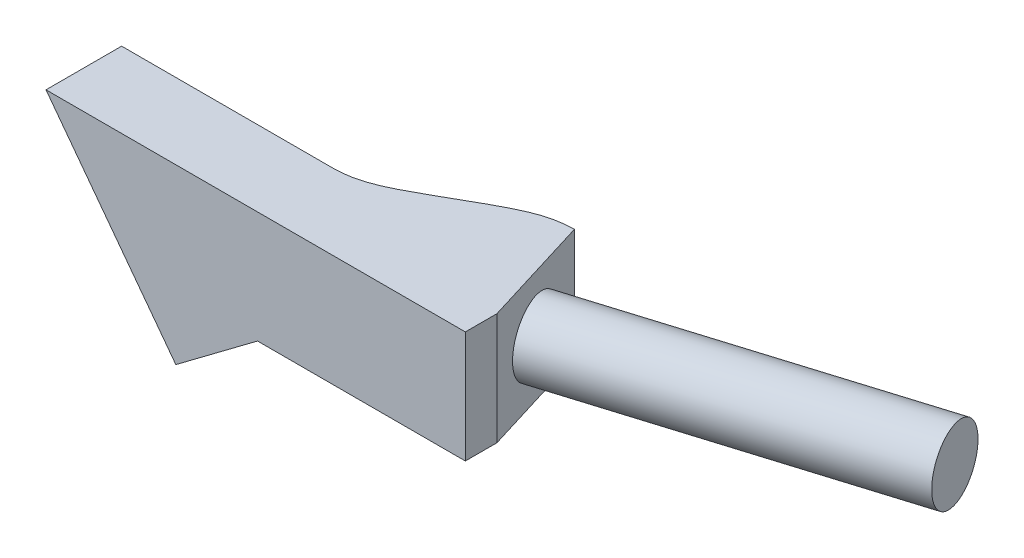
ISO-10303-21;
HEADER;
FILE_DESCRIPTION(('STEP AP214'),'2;1');
FILE_NAME('part.step','',(''),(''),'','','');
FILE_SCHEMA(('AUTOMOTIVE_DESIGN { 1 0 10303 214 1 1 1 1 }'));
ENDSEC;
DATA;
#1=APPLICATION_CONTEXT('core data for automotive mechanical design processes');
#2=APPLICATION_PROTOCOL_DEFINITION('international standard','automotive_design',2000,#1);
#3=PRODUCT_CONTEXT('',#1,'mechanical');
#4=PRODUCT('Part','Part','',(#3));
#5=PRODUCT_RELATED_PRODUCT_CATEGORY('part','',(#4));
#6=PRODUCT_DEFINITION_FORMATION('','',#4);
#7=PRODUCT_DEFINITION_CONTEXT('part definition',#1,'design');
#8=PRODUCT_DEFINITION('design','',#6,#7);
#9=PRODUCT_DEFINITION_SHAPE('','',#8);
#10=(LENGTH_UNIT() NAMED_UNIT(*) SI_UNIT(.MILLI.,.METRE.));
#11=(NAMED_UNIT(*) PLANE_ANGLE_UNIT() SI_UNIT($,.RADIAN.));
#12=(NAMED_UNIT(*) SI_UNIT($,.STERADIAN.) SOLID_ANGLE_UNIT());
#13=UNCERTAINTY_MEASURE_WITH_UNIT(LENGTH_MEASURE(1.E-05),#10,'distance_accuracy_value','');
#14=(GEOMETRIC_REPRESENTATION_CONTEXT(3) GLOBAL_UNCERTAINTY_ASSIGNED_CONTEXT((#13)) GLOBAL_UNIT_ASSIGNED_CONTEXT((#10,
#11,#12)) REPRESENTATION_CONTEXT('',''));
#15=CARTESIAN_POINT('',(0.,0.,0.));
#16=DIRECTION('',(0.,0.,1.));
#17=DIRECTION('',(1.,0.,0.));
#18=AXIS2_PLACEMENT_3D('',#15,#16,#17);
#19=CARTESIAN_POINT('',(-38.1,-12.7,-12.7));
#20=DIRECTION('',(0.,-1.,0.));
#21=DIRECTION('',(0.,0.,-1.));
#22=AXIS2_PLACEMENT_3D('',#19,#20,#21);
#23=PLANE('',#22);
#24=DIRECTION('',(0.293557838503509,0.,0.95594131381228));
#25=VECTOR('',#24,1.);
#26=CARTESIAN_POINT('',(31.2527609708644,-12.7,-9.59733910995649));
#27=LINE('',#26,#25);
#28=CARTESIAN_POINT('',(30.2999719122367,-12.7,-12.7));
#29=VERTEX_POINT('',#28);
#30=CARTESIAN_POINT('',(38.1,-12.7,12.7));
#31=VERTEX_POINT('',#30);
#32=EDGE_CURVE('E86',#29,#31,#27,.T.);
#33=ORIENTED_EDGE('',*,*,#32,.T.);
#34=DIRECTION('',(0.,0.,-1.));
#35=VECTOR('',#34,1.);
#36=CARTESIAN_POINT('',(38.1,-12.7,19.878167));
#37=LINE('',#36,#35);
#38=CARTESIAN_POINT('',(38.1,-12.7,19.878167));
#39=VERTEX_POINT('',#38);
#40=EDGE_CURVE('E125',#39,#31,#37,.T.);
#41=ORIENTED_EDGE('',*,*,#40,.F.);
#42=DIRECTION('',(1.,0.,0.));
#43=VECTOR('',#42,1.);
#44=CARTESIAN_POINT('',(-9.10564613460168,-12.7,19.878167));
#45=LINE('',#44,#43);
#46=CARTESIAN_POINT('',(-9.10564613460168,-12.7,19.878167));
#47=VERTEX_POINT('',#46);
#48=EDGE_CURVE('E133',#47,#39,#45,.T.);
#49=ORIENTED_EDGE('',*,*,#48,.F.);
#50=DIRECTION('',(0.,0.,-1.));
#51=VECTOR('',#50,1.);
#52=CARTESIAN_POINT('',(-9.10564613460168,-12.7,44.8615757491108));
#53=LINE('',#52,#51);
#54=CARTESIAN_POINT('',(-9.10564613460168,-12.7,2.7));
#55=VERTEX_POINT('',#54);
#56=EDGE_CURVE('E164',#47,#55,#53,.T.);
#57=ORIENTED_EDGE('',*,*,#56,.T.);
#58=CARTESIAN_POINT('',(30.2999719122367,-12.7,-12.7));
#59=CARTESIAN_POINT('',(25.4668031710884,-12.7,-12.7));
#60=CARTESIAN_POINT('',(16.7077981386719,-12.7,-8.78817181026553));
#61=CARTESIAN_POINT('',(4.44920628266022,-12.7,-1.21182818973447));
#62=CARTESIAN_POINT('',(-4.18514201423128,-12.7,2.7));
#63=CARTESIAN_POINT('',(-9.1056461346017,-12.7,2.7));
#64=B_SPLINE_CURVE_WITH_KNOTS('',3,(#58,#59,#60,#61,#62,#63),.UNSPECIFIED.,.F.,.F.,(4,1,1,4),
(0.,0.311689084079751,0.688310915920249,1.),.UNSPECIFIED.);
#65=EDGE_CURVE('E176',#29,#55,#64,.T.);
#66=ORIENTED_EDGE('',*,*,#65,.F.);
#67=EDGE_LOOP('',(#33,#41,#49,#57,#66));
#68=FACE_BOUND('',#67,.T.);
#69=ADVANCED_FACE('F67',(#68),#23,.T.);
#70=CARTESIAN_POINT('',(-38.1,12.7,-12.7));
#71=DIRECTION('',(0.,1.,0.));
#72=DIRECTION('',(0.,0.,1.));
#73=AXIS2_PLACEMENT_3D('',#70,#71,#72);
#74=PLANE('',#73);
#75=DIRECTION('',(0.,0.,-1.));
#76=VECTOR('',#75,1.);
#77=CARTESIAN_POINT('',(-57.1506044956256,12.7,44.8615757491108));
#78=LINE('',#77,#76);
#79=CARTESIAN_POINT('',(-57.1506044956256,12.7,19.878167));
#80=VERTEX_POINT('',#79);
#81=CARTESIAN_POINT('',(-57.1506044956256,12.7,2.69999999999999));
#82=VERTEX_POINT('',#81);
#83=EDGE_CURVE('E147',#80,#82,#78,.T.);
#84=ORIENTED_EDGE('',*,*,#83,.F.);
#85=DIRECTION('',(-1.,0.,0.));
#86=VECTOR('',#85,1.);
#87=CARTESIAN_POINT('',(38.1,12.7,19.878167));
#88=LINE('',#87,#86);
#89=CARTESIAN_POINT('',(38.1,12.7,19.878167));
#90=VERTEX_POINT('',#89);
#91=EDGE_CURVE('E132',#90,#80,#88,.T.);
#92=ORIENTED_EDGE('',*,*,#91,.F.);
#93=DIRECTION('',(0.,0.,-1.));
#94=VECTOR('',#93,1.);
#95=CARTESIAN_POINT('',(38.1,12.7,19.878167));
#96=LINE('',#95,#94);
#97=CARTESIAN_POINT('',(38.1,12.7,12.7));
#98=VERTEX_POINT('',#97);
#99=EDGE_CURVE('E127',#90,#98,#96,.T.);
#100=ORIENTED_EDGE('',*,*,#99,.T.);
#101=DIRECTION('',(0.293557838503509,0.,0.95594131381228));
#102=VECTOR('',#101,1.);
#103=CARTESIAN_POINT('',(31.2527609708644,12.7,-9.59733910995649));
#104=LINE('',#103,#102);
#105=CARTESIAN_POINT('',(30.2999719122367,12.7,-12.7));
#106=VERTEX_POINT('',#105);
#107=EDGE_CURVE('E172',#106,#98,#104,.T.);
#108=ORIENTED_EDGE('',*,*,#107,.F.);
#109=CARTESIAN_POINT('',(30.2999719122367,12.7,-12.7));
#110=CARTESIAN_POINT('',(25.4668031710884,12.7,-12.7));
#111=CARTESIAN_POINT('',(16.7077981386719,12.7,-8.78817181026553));
#112=CARTESIAN_POINT('',(4.44920628266022,12.7,-1.21182818973447));
#113=CARTESIAN_POINT('',(-4.18514201423128,12.7,2.7));
#114=CARTESIAN_POINT('',(-9.1056461346017,12.7,2.7));
#115=B_SPLINE_CURVE_WITH_KNOTS('',3,(#109,#110,#111,#112,#113,#114),.UNSPECIFIED.,.F.,.F.,(4,1,
1,4),(0.,0.311689084079751,0.688310915920249,1.),.UNSPECIFIED.);
#116=CARTESIAN_POINT('',(-9.10564613460168,12.7,2.7));
#117=VERTEX_POINT('',#116);
#118=EDGE_CURVE('E183',#106,#117,#115,.T.);
#119=ORIENTED_EDGE('',*,*,#118,.T.);
#120=DIRECTION('',(-1.,0.,0.));
#121=VECTOR('',#120,1.);
#122=CARTESIAN_POINT('',(-9.10564613460168,12.7,2.7));
#123=LINE('',#122,#121);
#124=EDGE_CURVE('E190',#117,#82,#123,.T.);
#125=ORIENTED_EDGE('',*,*,#124,.T.);
#126=EDGE_LOOP('',(#84,#92,#100,#108,#119,#125));
#127=FACE_BOUND('',#126,.T.);
#128=ADVANCED_FACE('F69',(#127),#74,.T.);
#129=DIRECTION('',(0.,-1.,0.));
#130=VECTOR('',#129,1.);
#131=SURFACE_OF_LINEAR_EXTRUSION('',#115,#130);
#132=ORIENTED_EDGE('',*,*,#65,.T.);
#133=DIRECTION('',(0.,-1.,0.));
#134=VECTOR('',#133,1.);
#135=CARTESIAN_POINT('',(-9.10564613460168,12.7,2.7));
#136=LINE('',#135,#134);
#137=EDGE_CURVE('E182',#117,#55,#136,.T.);
#138=ORIENTED_EDGE('',*,*,#137,.F.);
#139=ORIENTED_EDGE('',*,*,#118,.F.);
#140=DIRECTION('',(0.,-1.,0.));
#141=VECTOR('',#140,1.);
#142=CARTESIAN_POINT('',(30.2999719122367,12.7,-12.7));
#143=LINE('',#142,#141);
#144=EDGE_CURVE('E179',#106,#29,#143,.T.);
#145=ORIENTED_EDGE('',*,*,#144,.T.);
#146=EDGE_LOOP('',(#132,#138,#139,#145));
#147=FACE_BOUND('',#146,.T.);
#148=ADVANCED_FACE('F196',(#147),#131,.F.);
#149=CARTESIAN_POINT('',(-9.10564613460168,12.7,2.7));
#150=DIRECTION('',(0.,0.,1.));
#151=DIRECTION('',(1.,0.,0.));
#152=AXIS2_PLACEMENT_3D('',#149,#150,#151);
#153=PLANE('',#152);
#154=ORIENTED_EDGE('',*,*,#137,.T.);
#155=DIRECTION('',(-0.799990861180097,-0.60001218489988,0.));
#156=VECTOR('',#155,1.);
#157=CARTESIAN_POINT('',(2.81788840788857,-3.75706532445229,2.7));
#158=LINE('',#157,#156);
#159=CARTESIAN_POINT('',(-27.6616086521931,-26.6174135022947,2.7));
#160=VERTEX_POINT('',#159);
#161=EDGE_CURVE('E152',#55,#160,#158,.T.);
#162=ORIENTED_EDGE('',*,*,#161,.T.);
#163=DIRECTION('',(-0.60001218489988,0.799990861180097,0.));
#164=VECTOR('',#163,1.);
#165=CARTESIAN_POINT('',(-30.4794970600816,-22.8603481778424,2.7));
#166=LINE('',#165,#164);
#167=EDGE_CURVE('E160',#160,#82,#166,.T.);
#168=ORIENTED_EDGE('',*,*,#167,.T.);
#169=ORIENTED_EDGE('',*,*,#124,.F.);
#170=EDGE_LOOP('',(#154,#162,#168,#169));
#171=FACE_BOUND('',#170,.T.);
#172=ADVANCED_FACE('F199',(#171),#153,.F.);
#173=CARTESIAN_POINT('',(31.2527609708644,12.7,-9.59733910995649));
#174=DIRECTION('',(0.95594131381228,0.,-0.293557838503509));
#175=DIRECTION('',(-0.293557838503509,0.,-0.95594131381228));
#176=AXIS2_PLACEMENT_3D('',#173,#174,#175);
#177=PLANE('',#176);
#178=CARTESIAN_POINT('',(34.1999871533268,0.,3.89858789695552E-06));
#179=DIRECTION('',(0.95594131381228,0.,-0.293557838503509));
#180=DIRECTION('',(-0.293557838503509,0.,-0.95594131381228));
#181=AXIS2_PLACEMENT_3D('',#178,#179,#180);
#182=CIRCLE('',#181,7.9375);
#183=CARTESIAN_POINT('',(31.8698718102052,0.,-7.58778027979708));
#184=VERTEX_POINT('',#183);
#185=EDGE_CURVE('E12',#184,#184,#182,.T.);
#186=ORIENTED_EDGE('',*,*,#185,.F.);
#187=EDGE_LOOP('',(#186));
#188=FACE_BOUND('',#187,.T.);
#189=ORIENTED_EDGE('',*,*,#32,.F.);
#190=ORIENTED_EDGE('',*,*,#144,.F.);
#191=ORIENTED_EDGE('',*,*,#107,.T.);
#192=DIRECTION('',(0.,1.,0.));
#193=VECTOR('',#192,1.);
#194=CARTESIAN_POINT('',(38.1,-12.7,12.7));
#195=LINE('',#194,#193);
#196=EDGE_CURVE('E71',#31,#98,#195,.T.);
#197=ORIENTED_EDGE('',*,*,#196,.F.);
#198=EDGE_LOOP('',(#189,#190,#191,#197));
#199=FACE_BOUND('',#198,.T.);
#200=ADVANCED_FACE('F201',(#188,#199),#177,.T.);
#201=CARTESIAN_POINT('',(107.042715265823,0.,-22.3691033953795));
#202=DIRECTION('',(-0.95594131381228,0.,0.293557838503509));
#203=DIRECTION('',(0.293557838503509,0.,0.95594131381228));
#204=AXIS2_PLACEMENT_3D('',#201,#202,#203);
#205=CYLINDRICAL_SURFACE('',#204,7.9375);
#206=CARTESIAN_POINT('',(107.042715265823,0.,-22.3691033953795));
#207=DIRECTION('',(0.95594131381228,0.,-0.293557838503509));
#208=DIRECTION('',(-0.293557838503509,0.,-0.95594131381228));
#209=AXIS2_PLACEMENT_3D('',#206,#207,#208);
#210=CIRCLE('',#209,7.9375);
#211=CARTESIAN_POINT('',(104.712599922701,0.,-29.9568875737645));
#212=VERTEX_POINT('',#211);
#213=EDGE_CURVE('E167',#212,#212,#210,.T.);
#214=ORIENTED_EDGE('',*,*,#213,.F.);
#215=EDGE_LOOP('',(#214));
#216=FACE_BOUND('',#215,.T.);
#217=ORIENTED_EDGE('',*,*,#185,.T.);
#218=EDGE_LOOP('',(#217));
#219=FACE_BOUND('',#218,.T.);
#220=ADVANCED_FACE('F215',(#216,#219),#205,.T.);
#221=CARTESIAN_POINT('',(107.042715265823,0.,-22.3691033953795));
#222=DIRECTION('',(0.95594131381228,0.,-0.293557838503509));
#223=DIRECTION('',(-0.293557838503509,0.,-0.95594131381228));
#224=AXIS2_PLACEMENT_3D('',#221,#222,#223);
#225=PLANE('',#224);
#226=ORIENTED_EDGE('',*,*,#213,.T.);
#227=EDGE_LOOP('',(#226));
#228=FACE_BOUND('',#227,.T.);
#229=ADVANCED_FACE('F252',(#228),#225,.T.);
#230=CARTESIAN_POINT('',(2.81788840788857,-3.75706532445229,44.8615757491108));
#231=DIRECTION('',(0.60001218489988,-0.799990861180097,0.));
#232=DIRECTION('',(0.799990861180097,0.60001218489988,0.));
#233=AXIS2_PLACEMENT_3D('',#230,#231,#232);
#234=PLANE('',#233);
#235=ORIENTED_EDGE('',*,*,#56,.F.);
#236=DIRECTION('',(0.799990861180097,0.60001218489988,0.));
#237=VECTOR('',#236,1.);
#238=CARTESIAN_POINT('',(-27.661608652193,-26.6174135022947,19.878167));
#239=LINE('',#238,#237);
#240=CARTESIAN_POINT('',(-27.661608652193,-26.6174135022947,19.878167));
#241=VERTEX_POINT('',#240);
#242=EDGE_CURVE('E140',#241,#47,#239,.T.);
#243=ORIENTED_EDGE('',*,*,#242,.F.);
#244=DIRECTION('',(0.,0.,-1.));
#245=VECTOR('',#244,1.);
#246=CARTESIAN_POINT('',(-27.6616086521931,-26.6174135022947,44.8615757491108));
#247=LINE('',#246,#245);
#248=EDGE_CURVE('E163',#241,#160,#247,.T.);
#249=ORIENTED_EDGE('',*,*,#248,.T.);
#250=ORIENTED_EDGE('',*,*,#161,.F.);
#251=EDGE_LOOP('',(#235,#243,#249,#250));
#252=FACE_BOUND('',#251,.T.);
#253=ADVANCED_FACE('F242',(#252),#234,.T.);
#254=CARTESIAN_POINT('',(-30.4794970600816,-22.8603481778424,44.8615757491108));
#255=DIRECTION('',(-0.799990861180097,-0.60001218489988,0.));
#256=DIRECTION('',(0.60001218489988,-0.799990861180097,0.));
#257=AXIS2_PLACEMENT_3D('',#254,#255,#256);
#258=PLANE('',#257);
#259=ORIENTED_EDGE('',*,*,#248,.F.);
#260=DIRECTION('',(0.60001218489988,-0.799990861180097,0.));
#261=VECTOR('',#260,1.);
#262=CARTESIAN_POINT('',(-57.1506044956256,12.7,19.878167));
#263=LINE('',#262,#261);
#264=EDGE_CURVE('E235',#80,#241,#263,.T.);
#265=ORIENTED_EDGE('',*,*,#264,.F.);
#266=ORIENTED_EDGE('',*,*,#83,.T.);
#267=ORIENTED_EDGE('',*,*,#167,.F.);
#268=EDGE_LOOP('',(#259,#265,#266,#267));
#269=FACE_BOUND('',#268,.T.);
#270=ADVANCED_FACE('F244',(#269),#258,.T.);
#271=CARTESIAN_POINT('',(38.1,-12.7,19.878167));
#272=DIRECTION('',(-1.,0.,0.));
#273=DIRECTION('',(0.,0.,1.));
#274=AXIS2_PLACEMENT_3D('',#271,#272,#273);
#275=PLANE('',#274);
#276=ORIENTED_EDGE('',*,*,#196,.T.);
#277=ORIENTED_EDGE('',*,*,#99,.F.);
#278=DIRECTION('',(0.,1.,0.));
#279=VECTOR('',#278,1.);
#280=CARTESIAN_POINT('',(38.1,-12.7,19.878167));
#281=LINE('',#280,#279);
#282=EDGE_CURVE('E120',#39,#90,#281,.T.);
#283=ORIENTED_EDGE('',*,*,#282,.F.);
#284=ORIENTED_EDGE('',*,*,#40,.T.);
#285=EDGE_LOOP('',(#276,#277,#283,#284));
#286=FACE_BOUND('',#285,.T.);
#287=ADVANCED_FACE('F123',(#286),#275,.F.);
#288=CARTESIAN_POINT('',(0.,0.,19.878167));
#289=DIRECTION('',(0.,0.,1.));
#290=DIRECTION('',(1.,0.,0.));
#291=AXIS2_PLACEMENT_3D('',#288,#289,#290);
#292=PLANE('',#291);
#293=ORIENTED_EDGE('',*,*,#48,.T.);
#294=ORIENTED_EDGE('',*,*,#282,.T.);
#295=ORIENTED_EDGE('',*,*,#91,.T.);
#296=ORIENTED_EDGE('',*,*,#264,.T.);
#297=ORIENTED_EDGE('',*,*,#242,.T.);
#298=EDGE_LOOP('',(#293,#294,#295,#296,#297));
#299=FACE_BOUND('',#298,.T.);
#300=ADVANCED_FACE('F137',(#299),#292,.T.);
#301=CLOSED_SHELL('',(#69,#128,#148,#172,#200,#220,#229,#253,#270,#287,#300));
#302=MANIFOLD_SOLID_BREP('B2',#301);
#303=ADVANCED_BREP_SHAPE_REPRESENTATION('',(#18,#302),#14);
#304=SHAPE_DEFINITION_REPRESENTATION(#9,#303);
ENDSEC;
END-ISO-10303-21;
